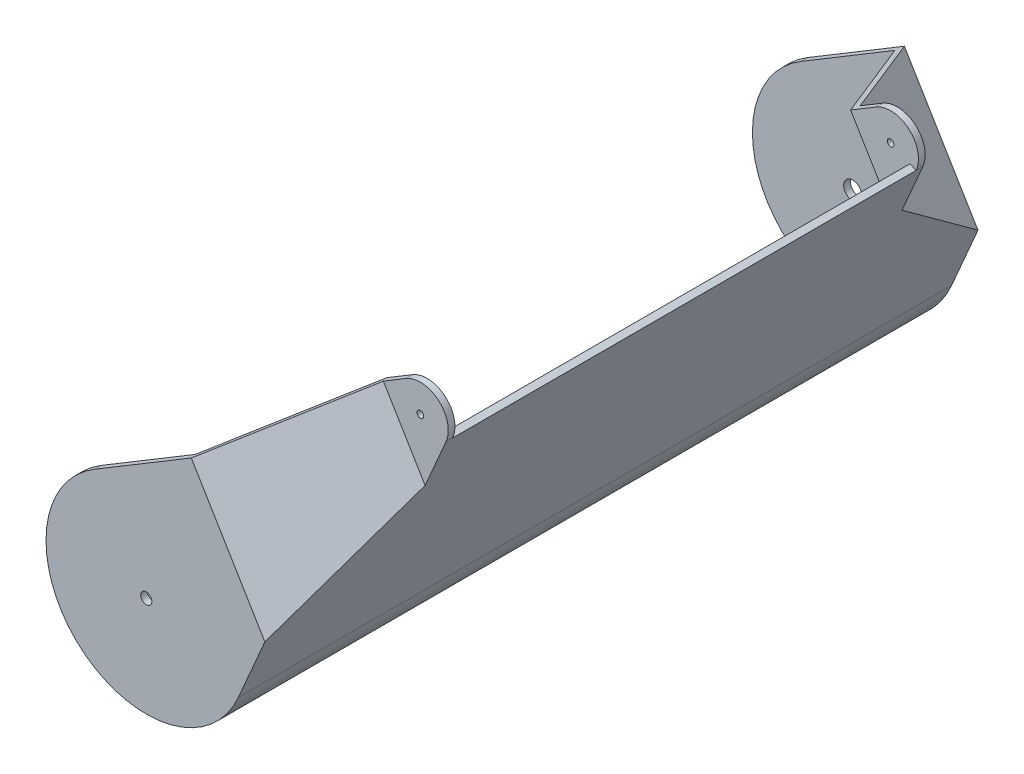
ISO-10303-21;
HEADER;
FILE_DESCRIPTION(('STEP AP214'),'2;1');
FILE_NAME('part.step','',(''),(''),'','','');
FILE_SCHEMA(('AUTOMOTIVE_DESIGN { 1 0 10303 214 1 1 1 1 }'));
ENDSEC;
DATA;
#1=APPLICATION_CONTEXT('core data for automotive mechanical design processes');
#2=APPLICATION_PROTOCOL_DEFINITION('international standard','automotive_design',2000,#1);
#3=PRODUCT_CONTEXT('',#1,'mechanical');
#4=PRODUCT('Part','Part','',(#3));
#5=PRODUCT_RELATED_PRODUCT_CATEGORY('part','',(#4));
#6=PRODUCT_DEFINITION_FORMATION('','',#4);
#7=PRODUCT_DEFINITION_CONTEXT('part definition',#1,'design');
#8=PRODUCT_DEFINITION('design','',#6,#7);
#9=PRODUCT_DEFINITION_SHAPE('','',#8);
#10=(LENGTH_UNIT() NAMED_UNIT(*) SI_UNIT(.MILLI.,.METRE.));
#11=(NAMED_UNIT(*) PLANE_ANGLE_UNIT() SI_UNIT($,.RADIAN.));
#12=(NAMED_UNIT(*) SI_UNIT($,.STERADIAN.) SOLID_ANGLE_UNIT());
#13=UNCERTAINTY_MEASURE_WITH_UNIT(LENGTH_MEASURE(1.E-05),#10,'distance_accuracy_value','');
#14=(GEOMETRIC_REPRESENTATION_CONTEXT(3) GLOBAL_UNCERTAINTY_ASSIGNED_CONTEXT((#13)) GLOBAL_UNIT_ASSIGNED_CONTEXT((#10,
#11,#12)) REPRESENTATION_CONTEXT('',''));
#15=CARTESIAN_POINT('',(0.,0.,0.));
#16=DIRECTION('',(0.,0.,1.));
#17=DIRECTION('',(1.,0.,0.));
#18=AXIS2_PLACEMENT_3D('',#15,#16,#17);
#19=CARTESIAN_POINT('',(70.,80.,160.));
#20=DIRECTION('',(0.,0.,-1.));
#21=DIRECTION('',(-1.,0.,0.));
#22=AXIS2_PLACEMENT_3D('',#19,#20,#21);
#23=CYLINDRICAL_SURFACE('',#22,1.5);
#24=CARTESIAN_POINT('',(70.,80.,-107.));
#25=DIRECTION('',(0.,0.,-1.));
#26=DIRECTION('',(-1.,0.,0.));
#27=AXIS2_PLACEMENT_3D('',#24,#25,#26);
#28=CIRCLE('',#27,1.5);
#29=CARTESIAN_POINT('',(68.5,80.,-107.));
#30=VERTEX_POINT('',#29);
#31=EDGE_CURVE('E327',#30,#30,#28,.T.);
#32=ORIENTED_EDGE('',*,*,#31,.T.);
#33=EDGE_LOOP('',(#32));
#34=FACE_BOUND('',#33,.T.);
#35=CARTESIAN_POINT('',(70.,80.,-104.));
#36=DIRECTION('',(0.,0.,1.));
#37=DIRECTION('',(1.,0.,0.));
#38=AXIS2_PLACEMENT_3D('',#35,#36,#37);
#39=CIRCLE('',#38,1.5);
#40=CARTESIAN_POINT('',(71.5,80.,-104.));
#41=VERTEX_POINT('',#40);
#42=EDGE_CURVE('E213',#41,#41,#39,.T.);
#43=ORIENTED_EDGE('',*,*,#42,.T.);
#44=EDGE_LOOP('',(#43));
#45=FACE_BOUND('',#44,.T.);
#46=ADVANCED_FACE('F42',(#34,#45),#23,.F.);
#47=CARTESIAN_POINT('',(41.3040782867211,-17.859818500881,0.));
#48=DIRECTION('',(-0.396884855575133,-0.917868406371581,0.));
#49=DIRECTION('',(0.,0.,-1.));
#50=AXIS2_PLACEMENT_3D('',#47,#48,#49);
#51=PLANE('',#50);
#52=DIRECTION('',(0.,0.,-1.));
#53=VECTOR('',#52,1.);
#54=CARTESIAN_POINT('',(38.750553471439,-16.7556783861481,160.));
#55=LINE('',#54,#53);
#56=CARTESIAN_POINT('',(38.750553471439,-16.7556783861481,157.));
#57=VERTEX_POINT('',#56);
#58=CARTESIAN_POINT('',(38.750553471439,-16.7556783861481,-157.));
#59=VERTEX_POINT('',#58);
#60=EDGE_CURVE('E220',#57,#59,#55,.T.);
#61=ORIENTED_EDGE('',*,*,#60,.F.);
#62=DIRECTION('',(-0.917868406371581,0.396884855575133,0.));
#63=VECTOR('',#62,1.);
#64=CARTESIAN_POINT('',(41.3040782867211,-17.859818500881,157.));
#65=LINE('',#64,#63);
#66=CARTESIAN_POINT('',(38.5504730676064,-16.6691639341556,157.));
#67=VERTEX_POINT('',#66);
#68=EDGE_CURVE('E286',#67,#57,#65,.F.);
#69=ORIENTED_EDGE('',*,*,#68,.F.);
#70=DIRECTION('',(0.,0.,1.));
#71=VECTOR('',#70,1.);
#72=CARTESIAN_POINT('',(38.5504730676064,-16.6691639341556,0.));
#73=LINE('',#72,#71);
#74=CARTESIAN_POINT('',(38.5504730676064,-16.6691639341556,-157.));
#75=VERTEX_POINT('',#74);
#76=EDGE_CURVE('E265',#67,#75,#73,.F.);
#77=ORIENTED_EDGE('',*,*,#76,.T.);
#78=DIRECTION('',(-0.917868406371581,0.396884855575133,0.));
#79=VECTOR('',#78,1.);
#80=CARTESIAN_POINT('',(41.3040782867211,-17.859818500881,-157.));
#81=LINE('',#80,#79);
#82=EDGE_CURVE('E282',#75,#59,#81,.F.);
#83=ORIENTED_EDGE('',*,*,#82,.T.);
#84=EDGE_LOOP('',(#61,#69,#77,#83));
#85=FACE_BOUND('',#84,.T.);
#86=ADVANCED_FACE('F489',(#85),#51,.T.);
#87=CARTESIAN_POINT('',(38.5504730676064,-16.6691639341556,160.));
#88=DIRECTION('',(0.917868406371581,-0.396884855575133,0.));
#89=DIRECTION('',(0.396884855575133,0.917868406371581,0.));
#90=AXIS2_PLACEMENT_3D('',#87,#88,#89);
#91=PLANE('',#90);
#92=DIRECTION('',(0.,0.,-1.));
#93=VECTOR('',#92,1.);
#94=CARTESIAN_POINT('',(48.9578597520604,7.39981047080047,160.));
#95=LINE('',#94,#93);
#96=CARTESIAN_POINT('',(48.9578597520604,7.39981047080047,157.));
#97=VERTEX_POINT('',#96);
#98=CARTESIAN_POINT('',(48.9578597520604,7.39981047080048,-157.));
#99=VERTEX_POINT('',#98);
#100=EDGE_CURVE('E203',#97,#99,#95,.T.);
#101=ORIENTED_EDGE('',*,*,#100,.F.);
#102=DIRECTION('',(-0.396884855575133,-0.917868406371581,0.));
#103=VECTOR('',#102,1.);
#104=CARTESIAN_POINT('',(38.5504730676064,-16.6691639341556,157.));
#105=LINE('',#104,#103);
#106=CARTESIAN_POINT('',(50.5732756064976,11.1357534152372,157.));
#107=VERTEX_POINT('',#106);
#108=EDGE_CURVE('E218',#107,#97,#105,.T.);
#109=ORIENTED_EDGE('',*,*,#108,.F.);
#110=DIRECTION('',(-0.265203293684222,-0.613330846765832,0.743970755758953));
#111=VECTOR('',#110,1.);
#112=CARTESIAN_POINT('',(44.6130934421298,-2.648251764212,173.720008140493));
#113=LINE('',#112,#111);
#114=CARTESIAN_POINT('',(69.4661883405807,54.8290499957297,104.));
#115=VERTEX_POINT('',#114);
#116=EDGE_CURVE('E240',#115,#107,#113,.T.);
#117=ORIENTED_EDGE('',*,*,#116,.F.);
#118=DIRECTION('',(-0.396884855575133,-0.917868406371581,0.));
#119=VECTOR('',#118,1.);
#120=CARTESIAN_POINT('',(38.5504730676064,-16.6691639341556,104.));
#121=LINE('',#120,#119);
#122=CARTESIAN_POINT('',(78.71974986053,76.2295938720362,104.));
#123=VERTEX_POINT('',#122);
#124=EDGE_CURVE('E246',#123,#115,#121,.T.);
#125=ORIENTED_EDGE('',*,*,#124,.F.);
#126=DIRECTION('',(0.,0.,-1.));
#127=VECTOR('',#126,1.);
#128=CARTESIAN_POINT('',(78.71974986053,76.2295938720362,160.));
#129=LINE('',#128,#127);
#130=CARTESIAN_POINT('',(78.71974986053,76.2295938720362,-104.));
#131=VERTEX_POINT('',#130);
#132=EDGE_CURVE('E257',#123,#131,#129,.T.);
#133=ORIENTED_EDGE('',*,*,#132,.T.);
#134=DIRECTION('',(0.396884855575133,0.917868406371581,0.));
#135=VECTOR('',#134,1.);
#136=CARTESIAN_POINT('',(38.5504730676064,-16.6691639341556,-104.));
#137=LINE('',#136,#135);
#138=CARTESIAN_POINT('',(69.4661883405807,54.8290499957296,-104.));
#139=VERTEX_POINT('',#138);
#140=EDGE_CURVE('E242',#139,#131,#137,.T.);
#141=ORIENTED_EDGE('',*,*,#140,.F.);
#142=DIRECTION('',(0.265203293684222,0.613330846765832,0.743970755758953));
#143=VECTOR('',#142,1.);
#144=CARTESIAN_POINT('',(107.750211788374,143.367816587357,3.39758719536254));
#145=LINE('',#144,#143);
#146=CARTESIAN_POINT('',(50.5732756064976,11.1357534152372,-157.));
#147=VERTEX_POINT('',#146);
#148=EDGE_CURVE('E237',#147,#139,#145,.T.);
#149=ORIENTED_EDGE('',*,*,#148,.F.);
#150=DIRECTION('',(-0.396884855575133,-0.917868406371581,0.));
#151=VECTOR('',#150,1.);
#152=CARTESIAN_POINT('',(38.5504730676064,-16.6691639341556,-157.));
#153=LINE('',#152,#151);
#154=EDGE_CURVE('E232',#147,#99,#153,.T.);
#155=ORIENTED_EDGE('',*,*,#154,.T.);
#156=EDGE_LOOP('',(#101,#109,#117,#125,#133,#141,#149,#155));
#157=FACE_BOUND('',#156,.T.);
#158=ADVANCED_FACE('F458',(#157),#91,.F.);
#159=DIRECTION('',(0.,0.,1.));
#160=VECTOR('',#159,1.);
#161=CARTESIAN_POINT('',(48.1426614327345,5.51451610462429,160.));
#162=LINE('',#161,#160);
#163=CARTESIAN_POINT('',(48.1426614327342,5.51451610462361,-157.));
#164=VERTEX_POINT('',#163);
#165=CARTESIAN_POINT('',(48.1426614327345,5.51451610462429,157.));
#166=VERTEX_POINT('',#165);
#167=EDGE_CURVE('E200',#164,#166,#162,.T.);
#168=ORIENTED_EDGE('',*,*,#167,.F.);
#169=EDGE_CURVE('E236',#164,#75,#153,.T.);
#170=ORIENTED_EDGE('',*,*,#169,.T.);
#171=ORIENTED_EDGE('',*,*,#76,.F.);
#172=EDGE_CURVE('E254',#166,#67,#105,.T.);
#173=ORIENTED_EDGE('',*,*,#172,.F.);
#174=EDGE_LOOP('',(#168,#170,#171,#173));
#175=FACE_BOUND('',#174,.T.);
#176=ADVANCED_FACE('F538',(#175),#91,.F.);
#177=CARTESIAN_POINT('',(0.,0.,157.));
#178=DIRECTION('',(0.,0.,1.));
#179=DIRECTION('',(1.,0.,0.));
#180=AXIS2_PLACEMENT_3D('',#177,#178,#179);
#181=PLANE('',#180);
#182=CARTESIAN_POINT('',(0.,0.,157.));
#183=DIRECTION('',(0.,0.,1.));
#184=DIRECTION('',(1.,0.,0.));
#185=AXIS2_PLACEMENT_3D('',#182,#183,#184);
#186=CIRCLE('',#185,2.5);
#187=CARTESIAN_POINT('',(2.5,0.,157.));
#188=VERTEX_POINT('',#187);
#189=EDGE_CURVE('E400',#188,#188,#186,.T.);
#190=ORIENTED_EDGE('',*,*,#189,.T.);
#191=EDGE_LOOP('',(#190));
#192=FACE_BOUND('',#191,.T.);
#193=CARTESIAN_POINT('',(0.,0.,157.));
#194=DIRECTION('',(0.,0.,1.));
#195=DIRECTION('',(1.,0.,0.));
#196=AXIS2_PLACEMENT_3D('',#193,#194,#195);
#197=CIRCLE('',#196,42.2179837571962);
#198=CARTESIAN_POINT('',(15.121399324024,-39.4170196109027,157.));
#199=VERTEX_POINT('',#198);
#200=EDGE_CURVE('E57',#199,#57,#197,.T.);
#201=ORIENTED_EDGE('',*,*,#200,.F.);
#202=DIRECTION('',(0.933654715431169,0.358174360267655,0.));
#203=VECTOR('',#202,1.);
#204=CARTESIAN_POINT('',(15.121399324024,-39.4170196109027,157.));
#205=LINE('',#204,#203);
#206=CARTESIAN_POINT('',(0.577892233965139,-44.9962891866198,157.));
#207=VERTEX_POINT('',#206);
#208=EDGE_CURVE('E61',#207,#199,#205,.T.);
#209=ORIENTED_EDGE('',*,*,#208,.F.);
#210=CARTESIAN_POINT('',(0.,0.,157.));
#211=DIRECTION('',(0.,0.,1.));
#212=DIRECTION('',(1.,0.,0.));
#213=AXIS2_PLACEMENT_3D('',#210,#211,#212);
#214=CIRCLE('',#213,45.);
#215=CARTESIAN_POINT('',(-23.1846092601725,38.5677831026509,157.));
#216=VERTEX_POINT('',#215);
#217=EDGE_CURVE('E231',#216,#207,#214,.T.);
#218=ORIENTED_EDGE('',*,*,#217,.F.);
#219=DIRECTION('',(0.857061846725576,0.515213539114944,0.));
#220=VECTOR('',#219,1.);
#221=CARTESIAN_POINT('',(-23.1846092601725,38.5677831026509,157.));
#222=LINE('',#221,#220);
#223=CARTESIAN_POINT('',(18.8814568215765,63.8553476645587,157.));
#224=VERTEX_POINT('',#223);
#225=EDGE_CURVE('E253',#216,#224,#222,.T.);
#226=ORIENTED_EDGE('',*,*,#225,.T.);
#227=DIRECTION('',(-0.515213539114944,0.857061846725576,0.));
#228=VECTOR('',#227,1.);
#229=CARTESIAN_POINT('',(42.066066081749,25.2875645619079,157.));
#230=LINE('',#229,#228);
#231=EDGE_CURVE('E255',#107,#224,#230,.T.);
#232=ORIENTED_EDGE('',*,*,#231,.F.);
#233=ORIENTED_EDGE('',*,*,#108,.T.);
#234=DIRECTION('',(0.917868406371581,-0.396884855575134,0.));
#235=VECTOR('',#234,1.);
#236=CARTESIAN_POINT('',(10.407386684454,24.0689744049561,157.));
#237=LINE('',#236,#235);
#238=CARTESIAN_POINT('',(48.9407196920812,7.40722180578287,157.));
#239=VERTEX_POINT('',#238);
#240=EDGE_CURVE('E207',#239,#97,#237,.T.);
#241=ORIENTED_EDGE('',*,*,#240,.F.);
#242=DIRECTION('',(0.388524044309554,0.921438585578739,0.));
#243=VECTOR('',#242,1.);
#244=CARTESIAN_POINT('',(38.901279239217,-16.4027017919409,157.));
#245=LINE('',#244,#243);
#246=EDGE_CURVE('E194',#166,#239,#245,.T.);
#247=ORIENTED_EDGE('',*,*,#246,.F.);
#248=ORIENTED_EDGE('',*,*,#172,.T.);
#249=ORIENTED_EDGE('',*,*,#68,.T.);
#250=EDGE_LOOP('',(#201,#209,#218,#226,#232,#233,#241,#247,#248,#249));
#251=FACE_BOUND('',#250,.T.);
#252=ADVANCED_FACE('F216',(#192,#251),#181,.F.);
#253=CARTESIAN_POINT('',(0.,0.,-157.));
#254=DIRECTION('',(0.,0.,1.));
#255=DIRECTION('',(1.,0.,0.));
#256=AXIS2_PLACEMENT_3D('',#253,#254,#255);
#257=PLANE('',#256);
#258=CARTESIAN_POINT('',(0.,0.,-157.));
#259=DIRECTION('',(0.,0.,1.));
#260=DIRECTION('',(1.,0.,0.));
#261=AXIS2_PLACEMENT_3D('',#258,#259,#260);
#262=CIRCLE('',#261,4.05);
#263=CARTESIAN_POINT('',(4.05,0.,-157.));
#264=VERTEX_POINT('',#263);
#265=EDGE_CURVE('E406',#264,#264,#262,.T.);
#266=ORIENTED_EDGE('',*,*,#265,.F.);
#267=EDGE_LOOP('',(#266));
#268=FACE_BOUND('',#267,.T.);
#269=DIRECTION('',(0.933654715431169,0.358174360267655,0.));
#270=VECTOR('',#269,1.);
#271=CARTESIAN_POINT('',(15.121399324024,-39.4170196109027,-157.));
#272=LINE('',#271,#270);
#273=CARTESIAN_POINT('',(0.577892233965139,-44.9962891866198,-157.));
#274=VERTEX_POINT('',#273);
#275=CARTESIAN_POINT('',(15.121399324024,-39.4170196109027,-157.));
#276=VERTEX_POINT('',#275);
#277=EDGE_CURVE('E50',#274,#276,#272,.T.);
#278=ORIENTED_EDGE('',*,*,#277,.T.);
#279=CARTESIAN_POINT('',(0.,0.,-157.));
#280=DIRECTION('',(0.,0.,1.));
#281=DIRECTION('',(1.,0.,0.));
#282=AXIS2_PLACEMENT_3D('',#279,#280,#281);
#283=CIRCLE('',#282,42.2179837571962);
#284=EDGE_CURVE('E12',#276,#59,#283,.T.);
#285=ORIENTED_EDGE('',*,*,#284,.T.);
#286=ORIENTED_EDGE('',*,*,#82,.F.);
#287=ORIENTED_EDGE('',*,*,#169,.F.);
#288=DIRECTION('',(0.388524044309554,0.921438585578739,0.));
#289=VECTOR('',#288,1.);
#290=CARTESIAN_POINT('',(38.901279239217,-16.4027017919409,-157.));
#291=LINE('',#290,#289);
#292=CARTESIAN_POINT('',(48.9407196920812,7.40722180578287,-157.));
#293=VERTEX_POINT('',#292);
#294=EDGE_CURVE('E370',#164,#293,#291,.T.);
#295=ORIENTED_EDGE('',*,*,#294,.T.);
#296=DIRECTION('',(0.917868406371581,-0.396884855575134,0.));
#297=VECTOR('',#296,1.);
#298=CARTESIAN_POINT('',(10.407386684454,24.0689744049561,-157.));
#299=LINE('',#298,#297);
#300=EDGE_CURVE('E210',#293,#99,#299,.T.);
#301=ORIENTED_EDGE('',*,*,#300,.T.);
#302=ORIENTED_EDGE('',*,*,#154,.F.);
#303=DIRECTION('',(-0.515213539114944,0.857061846725576,0.));
#304=VECTOR('',#303,1.);
#305=CARTESIAN_POINT('',(42.0660660817489,25.2875645619078,-157.));
#306=LINE('',#305,#304);
#307=CARTESIAN_POINT('',(18.8814568215765,63.8553476645587,-157.));
#308=VERTEX_POINT('',#307);
#309=EDGE_CURVE('E230',#147,#308,#306,.T.);
#310=ORIENTED_EDGE('',*,*,#309,.T.);
#311=DIRECTION('',(0.857061846725576,0.515213539114944,0.));
#312=VECTOR('',#311,1.);
#313=CARTESIAN_POINT('',(-23.1846092601725,38.5677831026509,-157.));
#314=LINE('',#313,#312);
#315=CARTESIAN_POINT('',(-23.1846092601725,38.5677831026509,-157.));
#316=VERTEX_POINT('',#315);
#317=EDGE_CURVE('E235',#316,#308,#314,.T.);
#318=ORIENTED_EDGE('',*,*,#317,.F.);
#319=CARTESIAN_POINT('',(0.,0.,-157.));
#320=DIRECTION('',(0.,0.,1.));
#321=DIRECTION('',(1.,0.,0.));
#322=AXIS2_PLACEMENT_3D('',#319,#320,#321);
#323=CIRCLE('',#322,45.);
#324=EDGE_CURVE('E280',#316,#274,#323,.T.);
#325=ORIENTED_EDGE('',*,*,#324,.T.);
#326=EDGE_LOOP('',(#278,#285,#286,#287,#295,#301,#302,#310,#318,#325));
#327=FACE_BOUND('',#326,.T.);
#328=ADVANCED_FACE('F379',(#268,#327),#257,.T.);
#329=CARTESIAN_POINT('',(70.,80.,160.));
#330=DIRECTION('',(0.,0.,-1.));
#331=DIRECTION('',(-1.,0.,0.));
#332=AXIS2_PLACEMENT_3D('',#329,#330,#331);
#333=CYLINDRICAL_SURFACE('',#332,12.5);
#334=DIRECTION('',(0.,0.,-1.));
#335=VECTOR('',#334,1.);
#336=CARTESIAN_POINT('',(63.5598307610632,90.7132730840697,160.));
#337=LINE('',#336,#335);
#338=CARTESIAN_POINT('',(63.5598307610632,90.7132730840697,-104.));
#339=VERTEX_POINT('',#338);
#340=CARTESIAN_POINT('',(63.5598307610632,90.7132730840697,-107.));
#341=VERTEX_POINT('',#340);
#342=EDGE_CURVE('E357',#339,#341,#337,.T.);
#343=ORIENTED_EDGE('',*,*,#342,.F.);
#344=CARTESIAN_POINT('',(70.,80.,-104.));
#345=DIRECTION('',(0.,0.,-1.));
#346=DIRECTION('',(-1.,0.,0.));
#347=AXIS2_PLACEMENT_3D('',#344,#345,#346);
#348=CIRCLE('',#347,12.5);
#349=CARTESIAN_POINT('',(81.4733550796448,75.0389393053108,-104.));
#350=VERTEX_POINT('',#349);
#351=EDGE_CURVE('E245',#339,#350,#348,.T.);
#352=ORIENTED_EDGE('',*,*,#351,.T.);
#353=DIRECTION('',(0.,0.,-1.));
#354=VECTOR('',#353,1.);
#355=CARTESIAN_POINT('',(81.4733550796448,75.0389393053108,160.));
#356=LINE('',#355,#354);
#357=CARTESIAN_POINT('',(81.4733550796448,75.0389393053108,-107.));
#358=VERTEX_POINT('',#357);
#359=EDGE_CURVE('E361',#350,#358,#356,.T.);
#360=ORIENTED_EDGE('',*,*,#359,.T.);
#361=CARTESIAN_POINT('',(70.,80.,-107.));
#362=DIRECTION('',(0.,0.,-1.));
#363=DIRECTION('',(-1.,0.,0.));
#364=AXIS2_PLACEMENT_3D('',#361,#362,#363);
#365=CIRCLE('',#364,12.5);
#366=EDGE_CURVE('E328',#341,#358,#365,.T.);
#367=ORIENTED_EDGE('',*,*,#366,.F.);
#368=EDGE_LOOP('',(#343,#352,#360,#367));
#369=FACE_BOUND('',#368,.T.);
#370=ADVANCED_FACE('F448',(#369),#333,.T.);
#371=CARTESIAN_POINT('',(-23.1846092601725,38.5677831026509,160.));
#372=DIRECTION('',(-0.515213539114944,0.857061846725576,0.));
#373=DIRECTION('',(-0.857061846725576,-0.515213539114944,0.));
#374=AXIS2_PLACEMENT_3D('',#371,#372,#373);
#375=PLANE('',#374);
#376=DIRECTION('',(-0.857061846725576,-0.515213539114944,0.));
#377=VECTOR('',#376,1.);
#378=CARTESIAN_POINT('',(-23.1846092601725,38.5677831026509,-104.));
#379=LINE('',#378,#377);
#380=CARTESIAN_POINT('',(52.052983679718,83.7960553459517,-104.));
#381=VERTEX_POINT('',#380);
#382=EDGE_CURVE('E272',#339,#381,#379,.T.);
#383=ORIENTED_EDGE('',*,*,#382,.F.);
#384=ORIENTED_EDGE('',*,*,#342,.T.);
#385=DIRECTION('',(-0.857061846725576,-0.515213539114944,0.));
#386=VECTOR('',#385,1.);
#387=CARTESIAN_POINT('',(53.3591376085869,84.5812357747533,-107.));
#388=LINE('',#387,#386);
#389=CARTESIAN_POINT('',(53.3591376085869,84.5812357747533,-107.));
#390=VERTEX_POINT('',#389);
#391=EDGE_CURVE('E305',#341,#390,#388,.T.);
#392=ORIENTED_EDGE('',*,*,#391,.T.);
#393=DIRECTION('',(-0.505450852043885,-0.303846359892364,-0.807587039116076));
#394=VECTOR('',#393,1.);
#395=CARTESIAN_POINT('',(20.1876107504454,64.6405280933603,-160.));
#396=LINE('',#395,#394);
#397=CARTESIAN_POINT('',(20.1876107504454,64.6405280933603,-160.));
#398=VERTEX_POINT('',#397);
#399=EDGE_CURVE('E308',#390,#398,#396,.T.);
#400=ORIENTED_EDGE('',*,*,#399,.T.);
#401=DIRECTION('',(0.857061846725576,0.515213539114944,0.));
#402=VECTOR('',#401,1.);
#403=CARTESIAN_POINT('',(-23.1846092601725,38.5677831026509,-160.));
#404=LINE('',#403,#402);
#405=CARTESIAN_POINT('',(-23.1846092601725,38.5677831026509,-160.));
#406=VERTEX_POINT('',#405);
#407=EDGE_CURVE('E347',#406,#398,#404,.T.);
#408=ORIENTED_EDGE('',*,*,#407,.F.);
#409=DIRECTION('',(0.,0.,-1.));
#410=VECTOR('',#409,1.);
#411=CARTESIAN_POINT('',(-23.1846092601725,38.5677831026509,160.));
#412=LINE('',#411,#410);
#413=EDGE_CURVE('E353',#316,#406,#412,.T.);
#414=ORIENTED_EDGE('',*,*,#413,.F.);
#415=ORIENTED_EDGE('',*,*,#317,.T.);
#416=DIRECTION('',(-0.505450852043885,-0.303846359892365,-0.807587039116076));
#417=VECTOR('',#416,1.);
#418=CARTESIAN_POINT('',(133.648737085661,132.846467576572,26.3700896557782));
#419=LINE('',#418,#417);
#420=EDGE_CURVE('E260',#381,#308,#419,.T.);
#421=ORIENTED_EDGE('',*,*,#420,.F.);
#422=EDGE_LOOP('',(#383,#384,#392,#400,#408,#414,#415,#421));
#423=FACE_BOUND('',#422,.T.);
#424=ADVANCED_FACE('F434',(#423),#375,.T.);
#425=CARTESIAN_POINT('',(41.3040782867211,-17.859818500881,160.));
#426=DIRECTION('',(0.917868406371581,-0.396884855575133,0.));
#427=DIRECTION('',(0.396884855575133,0.917868406371581,0.));
#428=AXIS2_PLACEMENT_3D('',#425,#426,#427);
#429=PLANE('',#428);
#430=DIRECTION('',(0.,0.,-1.));
#431=VECTOR('',#430,1.);
#432=CARTESIAN_POINT('',(41.3040782867211,-17.859818500881,160.));
#433=LINE('',#432,#431);
#434=CARTESIAN_POINT('',(41.3040782867211,-17.859818500881,160.));
#435=VERTEX_POINT('',#434);
#436=CARTESIAN_POINT('',(41.3040782867211,-17.859818500881,-160.));
#437=VERTEX_POINT('',#436);
#438=EDGE_CURVE('E344',#435,#437,#433,.T.);
#439=ORIENTED_EDGE('',*,*,#438,.T.);
#440=DIRECTION('',(-0.396884855575133,-0.917868406371581,0.));
#441=VECTOR('',#440,1.);
#442=CARTESIAN_POINT('',(41.3040782867211,-17.859818500881,-160.));
#443=LINE('',#442,#441);
#444=CARTESIAN_POINT('',(53.218231131425,9.69382667156778,-160.));
#445=VERTEX_POINT('',#444);
#446=EDGE_CURVE('E334',#445,#437,#443,.T.);
#447=ORIENTED_EDGE('',*,*,#446,.F.);
#448=DIRECTION('',(0.265203293684222,0.613330846765832,0.743970755758953));
#449=VECTOR('',#448,1.);
#450=CARTESIAN_POINT('',(111.035590702709,143.406985399693,2.19415716402269));
#451=LINE('',#450,#449);
#452=CARTESIAN_POINT('',(72.1111438655082,53.3871232520602,-107.));
#453=VERTEX_POINT('',#452);
#454=EDGE_CURVE('E314',#445,#453,#451,.T.);
#455=ORIENTED_EDGE('',*,*,#454,.T.);
#456=DIRECTION('',(0.396884855575133,0.917868406371581,0.));
#457=VECTOR('',#456,1.);
#458=CARTESIAN_POINT('',(41.3040782867211,-17.859818500881,-107.));
#459=LINE('',#458,#457);
#460=EDGE_CURVE('E331',#453,#358,#459,.T.);
#461=ORIENTED_EDGE('',*,*,#460,.T.);
#462=ORIENTED_EDGE('',*,*,#359,.F.);
#463=DIRECTION('',(0.,0.,-1.));
#464=VECTOR('',#463,1.);
#465=CARTESIAN_POINT('',(81.4733550796448,75.0389393053108,160.));
#466=LINE('',#465,#464);
#467=CARTESIAN_POINT('',(81.4733550796448,75.0389393053108,104.));
#468=VERTEX_POINT('',#467);
#469=EDGE_CURVE('E228',#468,#350,#466,.T.);
#470=ORIENTED_EDGE('',*,*,#469,.F.);
#471=CARTESIAN_POINT('',(81.4733550796448,75.0389393053108,107.));
#472=VERTEX_POINT('',#471);
#473=EDGE_CURVE('E362',#472,#468,#356,.T.);
#474=ORIENTED_EDGE('',*,*,#473,.F.);
#475=DIRECTION('',(-0.396884855575133,-0.917868406371581,0.));
#476=VECTOR('',#475,1.);
#477=CARTESIAN_POINT('',(41.3040782867211,-17.859818500881,107.));
#478=LINE('',#477,#476);
#479=CARTESIAN_POINT('',(72.1111438655082,53.3871232520602,107.));
#480=VERTEX_POINT('',#479);
#481=EDGE_CURVE('E324',#472,#480,#478,.T.);
#482=ORIENTED_EDGE('',*,*,#481,.T.);
#483=DIRECTION('',(-0.265203293684222,-0.613330846765832,0.743970755758953));
#484=VECTOR('',#483,1.);
#485=CARTESIAN_POINT('',(47.8984723564642,-2.60908295187623,174.923438171833));
#486=LINE('',#485,#484);
#487=CARTESIAN_POINT('',(53.218231131425,9.69382667156776,160.));
#488=VERTEX_POINT('',#487);
#489=EDGE_CURVE('E318',#480,#488,#486,.T.);
#490=ORIENTED_EDGE('',*,*,#489,.T.);
#491=DIRECTION('',(-0.396884855575133,-0.917868406371581,0.));
#492=VECTOR('',#491,1.);
#493=CARTESIAN_POINT('',(41.3040782867211,-17.859818500881,160.));
#494=LINE('',#493,#492);
#495=EDGE_CURVE('E335',#488,#435,#494,.T.);
#496=ORIENTED_EDGE('',*,*,#495,.T.);
#497=EDGE_LOOP('',(#439,#447,#455,#461,#462,#470,#474,#482,#490,#496));
#498=FACE_BOUND('',#497,.T.);
#499=ADVANCED_FACE('F44',(#498),#429,.T.);
#500=ORIENTED_EDGE('',*,*,#473,.T.);
#501=CARTESIAN_POINT('',(70.,80.,104.));
#502=DIRECTION('',(0.,0.,1.));
#503=DIRECTION('',(1.,0.,0.));
#504=AXIS2_PLACEMENT_3D('',#501,#502,#503);
#505=CIRCLE('',#504,12.5);
#506=CARTESIAN_POINT('',(63.5598307610632,90.7132730840697,104.));
#507=VERTEX_POINT('',#506);
#508=EDGE_CURVE('E249',#468,#507,#505,.T.);
#509=ORIENTED_EDGE('',*,*,#508,.T.);
#510=CARTESIAN_POINT('',(63.5598307610633,90.7132730840697,107.));
#511=VERTEX_POINT('',#510);
#512=EDGE_CURVE('E358',#511,#507,#337,.T.);
#513=ORIENTED_EDGE('',*,*,#512,.F.);
#514=CARTESIAN_POINT('',(70.,80.,107.));
#515=DIRECTION('',(0.,0.,1.));
#516=DIRECTION('',(1.,0.,0.));
#517=AXIS2_PLACEMENT_3D('',#514,#515,#516);
#518=CIRCLE('',#517,12.5);
#519=EDGE_CURVE('E322',#472,#511,#518,.T.);
#520=ORIENTED_EDGE('',*,*,#519,.F.);
#521=EDGE_LOOP('',(#500,#509,#513,#520));
#522=FACE_BOUND('',#521,.T.);
#523=ADVANCED_FACE('F466',(#522),#333,.T.);
#524=ORIENTED_EDGE('',*,*,#225,.F.);
#525=CARTESIAN_POINT('',(-23.1846092601725,38.5677831026509,160.));
#526=VERTEX_POINT('',#525);
#527=EDGE_CURVE('E354',#526,#216,#412,.T.);
#528=ORIENTED_EDGE('',*,*,#527,.F.);
#529=DIRECTION('',(0.857061846725576,0.515213539114944,0.));
#530=VECTOR('',#529,1.);
#531=CARTESIAN_POINT('',(-23.1846092601725,38.5677831026509,160.));
#532=LINE('',#531,#530);
#533=CARTESIAN_POINT('',(20.1876107504454,64.6405280933603,160.));
#534=VERTEX_POINT('',#533);
#535=EDGE_CURVE('E337',#526,#534,#532,.T.);
#536=ORIENTED_EDGE('',*,*,#535,.T.);
#537=DIRECTION('',(0.505450852043885,0.303846359892364,-0.807587039116076));
#538=VECTOR('',#537,1.);
#539=CARTESIAN_POINT('',(53.3591376085869,84.5812357747533,107.));
#540=LINE('',#539,#538);
#541=CARTESIAN_POINT('',(53.3591376085869,84.5812357747533,107.));
#542=VERTEX_POINT('',#541);
#543=EDGE_CURVE('E285',#534,#542,#540,.T.);
#544=ORIENTED_EDGE('',*,*,#543,.T.);
#545=DIRECTION('',(0.857061846725576,0.515213539114944,0.));
#546=VECTOR('',#545,1.);
#547=CARTESIAN_POINT('',(75.9729741915183,98.1753011544826,107.));
#548=LINE('',#547,#546);
#549=EDGE_CURVE('E302',#542,#511,#548,.T.);
#550=ORIENTED_EDGE('',*,*,#549,.T.);
#551=ORIENTED_EDGE('',*,*,#512,.T.);
#552=DIRECTION('',(0.857061846725576,0.515213539114944,0.));
#553=VECTOR('',#552,1.);
#554=CARTESIAN_POINT('',(-23.1846092601725,38.5677831026509,104.));
#555=LINE('',#554,#553);
#556=CARTESIAN_POINT('',(52.052983679718,83.7960553459517,104.));
#557=VERTEX_POINT('',#556);
#558=EDGE_CURVE('E275',#557,#507,#555,.T.);
#559=ORIENTED_EDGE('',*,*,#558,.F.);
#560=DIRECTION('',(0.505450852043885,0.303846359892365,-0.807587039116076));
#561=VECTOR('',#560,1.);
#562=CARTESIAN_POINT('',(3.02615883899873,54.3241052944366,182.332894583668));
#563=LINE('',#562,#561);
#564=EDGE_CURVE('E227',#224,#557,#563,.T.);
#565=ORIENTED_EDGE('',*,*,#564,.F.);
#566=EDGE_LOOP('',(#524,#528,#536,#544,#550,#551,#559,#565));
#567=FACE_BOUND('',#566,.T.);
#568=ADVANCED_FACE('F474',(#567),#375,.T.);
#569=CARTESIAN_POINT('',(0.,0.,160.));
#570=DIRECTION('',(0.,0.,1.));
#571=DIRECTION('',(1.,0.,0.));
#572=AXIS2_PLACEMENT_3D('',#569,#570,#571);
#573=PLANE('',#572);
#574=CARTESIAN_POINT('',(0.,0.,160.));
#575=DIRECTION('',(0.,0.,1.));
#576=DIRECTION('',(1.,0.,0.));
#577=AXIS2_PLACEMENT_3D('',#574,#575,#576);
#578=CIRCLE('',#577,2.5);
#579=CARTESIAN_POINT('',(2.5,0.,160.));
#580=VERTEX_POINT('',#579);
#581=EDGE_CURVE('E403',#580,#580,#578,.T.);
#582=ORIENTED_EDGE('',*,*,#581,.F.);
#583=EDGE_LOOP('',(#582));
#584=FACE_BOUND('',#583,.T.);
#585=CARTESIAN_POINT('',(0.,0.,160.));
#586=DIRECTION('',(0.,0.,1.));
#587=DIRECTION('',(1.,0.,0.));
#588=AXIS2_PLACEMENT_3D('',#585,#586,#587);
#589=CIRCLE('',#588,45.);
#590=EDGE_CURVE('E341',#526,#435,#589,.T.);
#591=ORIENTED_EDGE('',*,*,#590,.T.);
#592=ORIENTED_EDGE('',*,*,#495,.F.);
#593=DIRECTION('',(-0.515213539114944,0.857061846725576,0.));
#594=VECTOR('',#593,1.);
#595=CARTESIAN_POINT('',(43.3722200106178,26.0727449907094,160.));
#596=LINE('',#595,#594);
#597=EDGE_CURVE('E367',#488,#534,#596,.T.);
#598=ORIENTED_EDGE('',*,*,#597,.T.);
#599=ORIENTED_EDGE('',*,*,#535,.F.);
#600=EDGE_LOOP('',(#591,#592,#598,#599));
#601=FACE_BOUND('',#600,.T.);
#602=ADVANCED_FACE('F419',(#584,#601),#573,.T.);
#603=CARTESIAN_POINT('',(0.,0.,-160.));
#604=DIRECTION('',(0.,0.,1.));
#605=DIRECTION('',(1.,0.,0.));
#606=AXIS2_PLACEMENT_3D('',#603,#604,#605);
#607=PLANE('',#606);
#608=CARTESIAN_POINT('',(0.,0.,-160.));
#609=DIRECTION('',(0.,0.,-1.));
#610=DIRECTION('',(-1.,0.,0.));
#611=AXIS2_PLACEMENT_3D('',#608,#609,#610);
#612=CIRCLE('',#611,4.05);
#613=CARTESIAN_POINT('',(-4.05,0.,-160.));
#614=VERTEX_POINT('',#613);
#615=EDGE_CURVE('E409',#614,#614,#612,.T.);
#616=ORIENTED_EDGE('',*,*,#615,.F.);
#617=EDGE_LOOP('',(#616));
#618=FACE_BOUND('',#617,.T.);
#619=ORIENTED_EDGE('',*,*,#446,.T.);
#620=CARTESIAN_POINT('',(0.,0.,-160.));
#621=DIRECTION('',(0.,0.,1.));
#622=DIRECTION('',(1.,0.,0.));
#623=AXIS2_PLACEMENT_3D('',#620,#621,#622);
#624=CIRCLE('',#623,45.);
#625=EDGE_CURVE('E338',#406,#437,#624,.T.);
#626=ORIENTED_EDGE('',*,*,#625,.F.);
#627=ORIENTED_EDGE('',*,*,#407,.T.);
#628=DIRECTION('',(-0.515213539114944,0.857061846725576,0.));
#629=VECTOR('',#628,1.);
#630=CARTESIAN_POINT('',(43.3722200106179,26.0727449907094,-160.));
#631=LINE('',#630,#629);
#632=EDGE_CURVE('E365',#445,#398,#631,.T.);
#633=ORIENTED_EDGE('',*,*,#632,.F.);
#634=EDGE_LOOP('',(#619,#626,#627,#633));
#635=FACE_BOUND('',#634,.T.);
#636=ADVANCED_FACE('F415',(#618,#635),#607,.F.);
#637=CARTESIAN_POINT('',(0.,0.,160.));
#638=DIRECTION('',(0.,0.,-1.));
#639=DIRECTION('',(-1.,0.,0.));
#640=AXIS2_PLACEMENT_3D('',#637,#638,#639);
#641=CYLINDRICAL_SURFACE('',#640,45.);
#642=ORIENTED_EDGE('',*,*,#438,.F.);
#643=ORIENTED_EDGE('',*,*,#590,.F.);
#644=ORIENTED_EDGE('',*,*,#527,.T.);
#645=ORIENTED_EDGE('',*,*,#217,.T.);
#646=DIRECTION('',(0.,0.,-1.));
#647=VECTOR('',#646,1.);
#648=CARTESIAN_POINT('',(0.577892233965139,-44.9962891866198,160.));
#649=LINE('',#648,#647);
#650=EDGE_CURVE('E212',#207,#274,#649,.T.);
#651=ORIENTED_EDGE('',*,*,#650,.T.);
#652=ORIENTED_EDGE('',*,*,#324,.F.);
#653=ORIENTED_EDGE('',*,*,#413,.T.);
#654=ORIENTED_EDGE('',*,*,#625,.T.);
#655=EDGE_LOOP('',(#642,#643,#644,#645,#651,#652,#653,#654));
#656=FACE_BOUND('',#655,.T.);
#657=ADVANCED_FACE('F418',(#656),#641,.T.);
#658=CARTESIAN_POINT('',(85.1420757869582,-43.4117444709396,-160.));
#659=DIRECTION('',(0.692152039136464,0.416079776566352,-0.589748399109086));
#660=DIRECTION('',(-0.648554014560449,0.,-0.761168634533456));
#661=AXIS2_PLACEMENT_3D('',#658,#659,#660);
#662=PLANE('',#661);
#663=ORIENTED_EDGE('',*,*,#632,.T.);
#664=ORIENTED_EDGE('',*,*,#399,.F.);
#665=DIRECTION('',(-0.515213539114944,0.857061846725576,0.));
#666=VECTOR('',#665,1.);
#667=CARTESIAN_POINT('',(118.3136026451,-23.4710367895466,-107.));
#668=LINE('',#667,#666);
#669=EDGE_CURVE('E312',#453,#390,#668,.T.);
#670=ORIENTED_EDGE('',*,*,#669,.F.);
#671=ORIENTED_EDGE('',*,*,#454,.F.);
#672=EDGE_LOOP('',(#663,#664,#670,#671));
#673=FACE_BOUND('',#672,.T.);
#674=ADVANCED_FACE('F440',(#673),#662,.T.);
#675=CARTESIAN_POINT('',(118.3136026451,-23.4710367895466,-107.));
#676=DIRECTION('',(0.,0.,-1.));
#677=DIRECTION('',(-1.,0.,0.));
#678=AXIS2_PLACEMENT_3D('',#675,#676,#677);
#679=PLANE('',#678);
#680=ORIENTED_EDGE('',*,*,#31,.F.);
#681=EDGE_LOOP('',(#680));
#682=FACE_BOUND('',#681,.T.);
#683=ORIENTED_EDGE('',*,*,#669,.T.);
#684=ORIENTED_EDGE('',*,*,#391,.F.);
#685=ORIENTED_EDGE('',*,*,#366,.T.);
#686=ORIENTED_EDGE('',*,*,#460,.F.);
#687=EDGE_LOOP('',(#683,#684,#685,#686));
#688=FACE_BOUND('',#687,.T.);
#689=ADVANCED_FACE('F444',(#682,#688),#679,.T.);
#690=CARTESIAN_POINT('',(140.927439228031,-9.87697140981725,107.));
#691=DIRECTION('',(0.,0.,1.));
#692=DIRECTION('',(1.,0.,0.));
#693=AXIS2_PLACEMENT_3D('',#690,#691,#692);
#694=PLANE('',#693);
#695=CARTESIAN_POINT('',(70.,80.,107.));
#696=DIRECTION('',(0.,0.,1.));
#697=DIRECTION('',(1.,0.,0.));
#698=AXIS2_PLACEMENT_3D('',#695,#696,#697);
#699=CIRCLE('',#698,1.5);
#700=CARTESIAN_POINT('',(71.5,80.,107.));
#701=VERTEX_POINT('',#700);
#702=EDGE_CURVE('E321',#701,#701,#699,.T.);
#703=ORIENTED_EDGE('',*,*,#702,.F.);
#704=EDGE_LOOP('',(#703));
#705=FACE_BOUND('',#704,.T.);
#706=ORIENTED_EDGE('',*,*,#519,.T.);
#707=ORIENTED_EDGE('',*,*,#549,.F.);
#708=DIRECTION('',(-0.515213539114944,0.857061846725576,0.));
#709=VECTOR('',#708,1.);
#710=CARTESIAN_POINT('',(118.3136026451,-23.4710367895466,107.));
#711=LINE('',#710,#709);
#712=EDGE_CURVE('E311',#480,#542,#711,.T.);
#713=ORIENTED_EDGE('',*,*,#712,.F.);
#714=ORIENTED_EDGE('',*,*,#481,.F.);
#715=EDGE_LOOP('',(#706,#707,#713,#714));
#716=FACE_BOUND('',#715,.T.);
#717=ADVANCED_FACE('F470',(#705,#716),#694,.T.);
#718=CARTESIAN_POINT('',(118.3136026451,-23.4710367895466,107.));
#719=DIRECTION('',(0.692152039136464,0.416079776566352,0.589748399109086));
#720=DIRECTION('',(0.648554014560449,0.,-0.761168634533456));
#721=AXIS2_PLACEMENT_3D('',#718,#719,#720);
#722=PLANE('',#721);
#723=ORIENTED_EDGE('',*,*,#712,.T.);
#724=ORIENTED_EDGE('',*,*,#543,.F.);
#725=ORIENTED_EDGE('',*,*,#597,.F.);
#726=ORIENTED_EDGE('',*,*,#489,.F.);
#727=EDGE_LOOP('',(#723,#724,#725,#726));
#728=FACE_BOUND('',#727,.T.);
#729=ADVANCED_FACE('F477',(#728),#722,.T.);
#730=CARTESIAN_POINT('',(70.,80.,104.));
#731=DIRECTION('',(0.,0.,1.));
#732=DIRECTION('',(1.,0.,0.));
#733=AXIS2_PLACEMENT_3D('',#730,#731,#732);
#734=CIRCLE('',#733,1.5);
#735=CARTESIAN_POINT('',(71.5,80.,104.));
#736=VERTEX_POINT('',#735);
#737=EDGE_CURVE('E397',#736,#736,#734,.T.);
#738=ORIENTED_EDGE('',*,*,#737,.F.);
#739=EDGE_LOOP('',(#738));
#740=FACE_BOUND('',#739,.T.);
#741=ORIENTED_EDGE('',*,*,#702,.T.);
#742=EDGE_LOOP('',(#741));
#743=FACE_BOUND('',#742,.T.);
#744=ADVANCED_FACE('F492',(#740,#743),#23,.F.);
#745=CARTESIAN_POINT('',(81.4733550796448,75.0389393053108,0.));
#746=DIRECTION('',(-0.396884855575134,-0.917868406371581,0.));
#747=DIRECTION('',(0.,0.,-1.));
#748=AXIS2_PLACEMENT_3D('',#745,#746,#747);
#749=PLANE('',#748);
#750=ORIENTED_EDGE('',*,*,#469,.T.);
#751=DIRECTION('',(0.917868406371581,-0.396884855575134,0.));
#752=VECTOR('',#751,1.);
#753=CARTESIAN_POINT('',(81.4733550796448,75.0389393053108,-104.));
#754=LINE('',#753,#752);
#755=EDGE_CURVE('E266',#131,#350,#754,.T.);
#756=ORIENTED_EDGE('',*,*,#755,.F.);
#757=ORIENTED_EDGE('',*,*,#132,.F.);
#758=DIRECTION('',(0.917868406371581,-0.396884855575134,0.));
#759=VECTOR('',#758,1.);
#760=CARTESIAN_POINT('',(162.496228479648,40.0047762548998,104.));
#761=LINE('',#760,#759);
#762=EDGE_CURVE('E269',#123,#468,#761,.T.);
#763=ORIENTED_EDGE('',*,*,#762,.T.);
#764=EDGE_LOOP('',(#750,#756,#757,#763));
#765=FACE_BOUND('',#764,.T.);
#766=ADVANCED_FACE('F462',(#765),#749,.F.);
#767=CARTESIAN_POINT('',(83.0656196695488,-44.6599838006386,-158.230754802673));
#768=DIRECTION('',(0.692152039136464,0.416079776566352,-0.589748399109086));
#769=DIRECTION('',(-0.648554014560449,0.,-0.761168634533456));
#770=AXIS2_PLACEMENT_3D('',#767,#768,#769);
#771=PLANE('',#770);
#772=ORIENTED_EDGE('',*,*,#309,.F.);
#773=ORIENTED_EDGE('',*,*,#148,.T.);
#774=DIRECTION('',(-0.515213539114944,0.857061846725576,0.));
#775=VECTOR('',#774,1.);
#776=CARTESIAN_POINT('',(117.007448716231,-24.2562172183482,-104.));
#777=LINE('',#776,#775);
#778=EDGE_CURVE('E241',#139,#381,#777,.T.);
#779=ORIENTED_EDGE('',*,*,#778,.T.);
#780=ORIENTED_EDGE('',*,*,#420,.T.);
#781=EDGE_LOOP('',(#772,#773,#779,#780));
#782=FACE_BOUND('',#781,.T.);
#783=ADVANCED_FACE('F455',(#782),#771,.F.);
#784=CARTESIAN_POINT('',(118.3136026451,-23.4710367895466,-104.));
#785=DIRECTION('',(0.,0.,-1.));
#786=DIRECTION('',(-1.,0.,0.));
#787=AXIS2_PLACEMENT_3D('',#784,#785,#786);
#788=PLANE('',#787);
#789=ORIENTED_EDGE('',*,*,#778,.F.);
#790=ORIENTED_EDGE('',*,*,#140,.T.);
#791=ORIENTED_EDGE('',*,*,#755,.T.);
#792=ORIENTED_EDGE('',*,*,#351,.F.);
#793=ORIENTED_EDGE('',*,*,#382,.T.);
#794=EDGE_LOOP('',(#789,#790,#791,#792,#793));
#795=FACE_BOUND('',#794,.T.);
#796=ORIENTED_EDGE('',*,*,#42,.F.);
#797=EDGE_LOOP('',(#796));
#798=FACE_BOUND('',#797,.T.);
#799=ADVANCED_FACE('F451',(#795,#798),#788,.F.);
#800=CARTESIAN_POINT('',(140.927439228031,-9.87697140981725,104.));
#801=DIRECTION('',(0.,0.,1.));
#802=DIRECTION('',(1.,0.,0.));
#803=AXIS2_PLACEMENT_3D('',#800,#801,#802);
#804=PLANE('',#803);
#805=ORIENTED_EDGE('',*,*,#508,.F.);
#806=ORIENTED_EDGE('',*,*,#762,.F.);
#807=ORIENTED_EDGE('',*,*,#124,.T.);
#808=DIRECTION('',(-0.515213539114944,0.857061846725576,0.));
#809=VECTOR('',#808,1.);
#810=CARTESIAN_POINT('',(117.007448716231,-24.2562172183482,104.));
#811=LINE('',#810,#809);
#812=EDGE_CURVE('E258',#115,#557,#811,.T.);
#813=ORIENTED_EDGE('',*,*,#812,.T.);
#814=ORIENTED_EDGE('',*,*,#558,.T.);
#815=EDGE_LOOP('',(#805,#806,#807,#813,#814));
#816=FACE_BOUND('',#815,.T.);
#817=ORIENTED_EDGE('',*,*,#737,.T.);
#818=EDGE_LOOP('',(#817));
#819=FACE_BOUND('',#818,.T.);
#820=ADVANCED_FACE('F524',(#816,#819),#804,.F.);
#821=CARTESIAN_POINT('',(116.23714652769,-24.7192761192457,105.230754802673));
#822=DIRECTION('',(0.692152039136464,0.416079776566352,0.589748399109086));
#823=DIRECTION('',(0.648554014560449,0.,-0.761168634533456));
#824=AXIS2_PLACEMENT_3D('',#821,#822,#823);
#825=PLANE('',#824);
#826=ORIENTED_EDGE('',*,*,#812,.F.);
#827=ORIENTED_EDGE('',*,*,#116,.T.);
#828=ORIENTED_EDGE('',*,*,#231,.T.);
#829=ORIENTED_EDGE('',*,*,#564,.T.);
#830=EDGE_LOOP('',(#826,#827,#828,#829));
#831=FACE_BOUND('',#830,.T.);
#832=ADVANCED_FACE('F521',(#831),#825,.F.);
#833=CARTESIAN_POINT('',(38.901279239217,-16.4027017919409,160.));
#834=DIRECTION('',(0.921438585578739,-0.388524044309554,0.));
#835=DIRECTION('',(0.388524044309554,0.921438585578739,0.));
#836=AXIS2_PLACEMENT_3D('',#833,#834,#835);
#837=PLANE('',#836);
#838=ORIENTED_EDGE('',*,*,#167,.T.);
#839=ORIENTED_EDGE('',*,*,#246,.T.);
#840=DIRECTION('',(0.,0.,-1.));
#841=VECTOR('',#840,1.);
#842=CARTESIAN_POINT('',(48.9407196920812,7.40722180578287,160.));
#843=LINE('',#842,#841);
#844=EDGE_CURVE('E197',#239,#293,#843,.T.);
#845=ORIENTED_EDGE('',*,*,#844,.T.);
#846=ORIENTED_EDGE('',*,*,#294,.F.);
#847=EDGE_LOOP('',(#838,#839,#845,#846));
#848=FACE_BOUND('',#847,.T.);
#849=ADVANCED_FACE('F196',(#848),#837,.F.);
#850=CARTESIAN_POINT('',(10.407386684454,24.0689744049561,160.));
#851=DIRECTION('',(-0.396884855575134,-0.917868406371581,0.));
#852=DIRECTION('',(0.917868406371581,-0.396884855575134,0.));
#853=AXIS2_PLACEMENT_3D('',#850,#851,#852);
#854=PLANE('',#853);
#855=ORIENTED_EDGE('',*,*,#844,.F.);
#856=ORIENTED_EDGE('',*,*,#240,.T.);
#857=ORIENTED_EDGE('',*,*,#100,.T.);
#858=ORIENTED_EDGE('',*,*,#300,.F.);
#859=EDGE_LOOP('',(#855,#856,#857,#858));
#860=FACE_BOUND('',#859,.T.);
#861=ADVANCED_FACE('F206',(#860),#854,.F.);
#862=CARTESIAN_POINT('',(0.,0.,160.));
#863=DIRECTION('',(0.,0.,-1.));
#864=DIRECTION('',(-1.,0.,0.));
#865=AXIS2_PLACEMENT_3D('',#862,#863,#864);
#866=CYLINDRICAL_SURFACE('',#865,42.2179837571962);
#867=DIRECTION('',(0.,0.,-1.));
#868=VECTOR('',#867,1.);
#869=CARTESIAN_POINT('',(15.121399324024,-39.4170196109027,160.));
#870=LINE('',#869,#868);
#871=EDGE_CURVE('E389',#199,#276,#870,.T.);
#872=ORIENTED_EDGE('',*,*,#871,.F.);
#873=ORIENTED_EDGE('',*,*,#200,.T.);
#874=ORIENTED_EDGE('',*,*,#60,.T.);
#875=ORIENTED_EDGE('',*,*,#284,.F.);
#876=EDGE_LOOP('',(#872,#873,#874,#875));
#877=FACE_BOUND('',#876,.T.);
#878=ADVANCED_FACE('F388',(#877),#866,.F.);
#879=CARTESIAN_POINT('',(15.121399324024,-39.4170196109027,160.));
#880=DIRECTION('',(0.358174360267655,-0.933654715431169,0.));
#881=DIRECTION('',(0.933654715431169,0.358174360267655,0.));
#882=AXIS2_PLACEMENT_3D('',#879,#880,#881);
#883=PLANE('',#882);
#884=ORIENTED_EDGE('',*,*,#650,.F.);
#885=ORIENTED_EDGE('',*,*,#208,.T.);
#886=ORIENTED_EDGE('',*,*,#871,.T.);
#887=ORIENTED_EDGE('',*,*,#277,.F.);
#888=EDGE_LOOP('',(#884,#885,#886,#887));
#889=FACE_BOUND('',#888,.T.);
#890=ADVANCED_FACE('F390',(#889),#883,.F.);
#891=CARTESIAN_POINT('',(0.,0.,61.0000000000002));
#892=DIRECTION('',(0.,0.,1.));
#893=DIRECTION('',(1.,0.,0.));
#894=AXIS2_PLACEMENT_3D('',#891,#892,#893);
#895=CYLINDRICAL_SURFACE('',#894,2.5);
#896=ORIENTED_EDGE('',*,*,#581,.T.);
#897=EDGE_LOOP('',(#896));
#898=FACE_BOUND('',#897,.T.);
#899=ORIENTED_EDGE('',*,*,#189,.F.);
#900=EDGE_LOOP('',(#899));
#901=FACE_BOUND('',#900,.T.);
#902=ADVANCED_FACE('F550',(#898,#901),#895,.F.);
#903=CARTESIAN_POINT('',(0.,0.,-61.0000000000002));
#904=DIRECTION('',(0.,0.,-1.));
#905=DIRECTION('',(-1.,0.,0.));
#906=AXIS2_PLACEMENT_3D('',#903,#904,#905);
#907=CYLINDRICAL_SURFACE('',#906,4.05);
#908=ORIENTED_EDGE('',*,*,#265,.T.);
#909=EDGE_LOOP('',(#908));
#910=FACE_BOUND('',#909,.T.);
#911=ORIENTED_EDGE('',*,*,#615,.T.);
#912=EDGE_LOOP('',(#911));
#913=FACE_BOUND('',#912,.T.);
#914=ADVANCED_FACE('F413',(#910,#913),#907,.F.);
#915=CLOSED_SHELL('',(#46,#86,#158,#176,#252,#328,#370,#424,#499,#523,#568,#602,#636,#657,#674,
#689,#717,#729,#744,#766,#783,#799,#820,#832,#849,#861,#878,#890,#902,#914));
#916=MANIFOLD_SOLID_BREP('B2',#915);
#917=ADVANCED_BREP_SHAPE_REPRESENTATION('',(#18,#916),#14);
#918=SHAPE_DEFINITION_REPRESENTATION(#9,#917);
ENDSEC;
END-ISO-10303-21;
